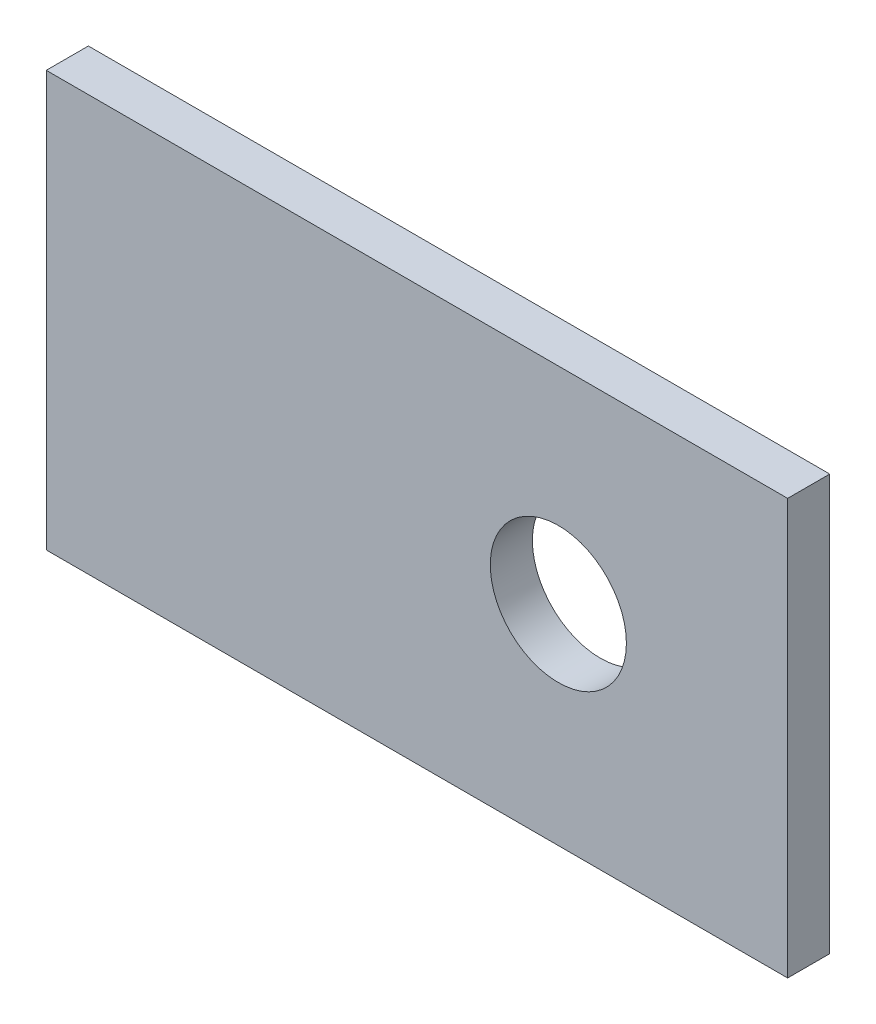
ISO-10303-21;
HEADER;
FILE_DESCRIPTION(('STEP AP214'),'2;1');
FILE_NAME('part.step','',(''),(''),'','','');
FILE_SCHEMA(('AUTOMOTIVE_DESIGN { 1 0 10303 214 1 1 1 1 }'));
ENDSEC;
DATA;
#1=APPLICATION_CONTEXT('core data for automotive mechanical design processes');
#2=APPLICATION_PROTOCOL_DEFINITION('international standard','automotive_design',2000,#1);
#3=PRODUCT_CONTEXT('',#1,'mechanical');
#4=PRODUCT('Part','Part','',(#3));
#5=PRODUCT_RELATED_PRODUCT_CATEGORY('part','',(#4));
#6=PRODUCT_DEFINITION_FORMATION('','',#4);
#7=PRODUCT_DEFINITION_CONTEXT('part definition',#1,'design');
#8=PRODUCT_DEFINITION('design','',#6,#7);
#9=PRODUCT_DEFINITION_SHAPE('','',#8);
#10=(LENGTH_UNIT() NAMED_UNIT(*) SI_UNIT(.MILLI.,.METRE.));
#11=(NAMED_UNIT(*) PLANE_ANGLE_UNIT() SI_UNIT($,.RADIAN.));
#12=(NAMED_UNIT(*) SI_UNIT($,.STERADIAN.) SOLID_ANGLE_UNIT());
#13=UNCERTAINTY_MEASURE_WITH_UNIT(LENGTH_MEASURE(1.E-05),#10,'distance_accuracy_value','');
#14=(GEOMETRIC_REPRESENTATION_CONTEXT(3) GLOBAL_UNCERTAINTY_ASSIGNED_CONTEXT((#13)) GLOBAL_UNIT_ASSIGNED_CONTEXT((#10,
#11,#12)) REPRESENTATION_CONTEXT('',''));
#15=CARTESIAN_POINT('',(0.,0.,0.));
#16=DIRECTION('',(0.,0.,1.));
#17=DIRECTION('',(1.,0.,0.));
#18=AXIS2_PLACEMENT_3D('',#15,#16,#17);
#19=CARTESIAN_POINT('',(26.415,-14.8,3.));
#20=DIRECTION('',(-1.,0.,0.));
#21=DIRECTION('',(0.,0.,1.));
#22=AXIS2_PLACEMENT_3D('',#19,#20,#21);
#23=PLANE('',#22);
#24=DIRECTION('',(0.,1.,0.));
#25=VECTOR('',#24,1.);
#26=CARTESIAN_POINT('',(26.415,-14.8,0.));
#27=LINE('',#26,#25);
#28=CARTESIAN_POINT('',(26.415,-14.8,0.));
#29=VERTEX_POINT('',#28);
#30=CARTESIAN_POINT('',(26.415,14.8,0.));
#31=VERTEX_POINT('',#30);
#32=EDGE_CURVE('E113',#29,#31,#27,.T.);
#33=ORIENTED_EDGE('',*,*,#32,.T.);
#34=DIRECTION('',(0.,0.,-1.));
#35=VECTOR('',#34,1.);
#36=CARTESIAN_POINT('',(26.415,14.8,3.));
#37=LINE('',#36,#35);
#38=CARTESIAN_POINT('',(26.415,14.8,3.));
#39=VERTEX_POINT('',#38);
#40=EDGE_CURVE('E11',#39,#31,#37,.T.);
#41=ORIENTED_EDGE('',*,*,#40,.F.);
#42=DIRECTION('',(0.,1.,0.));
#43=VECTOR('',#42,1.);
#44=CARTESIAN_POINT('',(26.415,-14.8,3.));
#45=LINE('',#44,#43);
#46=CARTESIAN_POINT('',(26.415,-14.8,3.));
#47=VERTEX_POINT('',#46);
#48=EDGE_CURVE('E96',#47,#39,#45,.T.);
#49=ORIENTED_EDGE('',*,*,#48,.F.);
#50=DIRECTION('',(0.,0.,-1.));
#51=VECTOR('',#50,1.);
#52=CARTESIAN_POINT('',(26.415,-14.8,3.));
#53=LINE('',#52,#51);
#54=EDGE_CURVE('E109',#47,#29,#53,.T.);
#55=ORIENTED_EDGE('',*,*,#54,.T.);
#56=EDGE_LOOP('',(#33,#41,#49,#55));
#57=FACE_BOUND('',#56,.T.);
#58=ADVANCED_FACE('F43',(#57),#23,.F.);
#59=CARTESIAN_POINT('',(-26.415,14.8,3.));
#60=DIRECTION('',(0.,-1.,0.));
#61=DIRECTION('',(0.,0.,-1.));
#62=AXIS2_PLACEMENT_3D('',#59,#60,#61);
#63=PLANE('',#62);
#64=DIRECTION('',(-1.,0.,0.));
#65=VECTOR('',#64,1.);
#66=CARTESIAN_POINT('',(-26.415,14.8,0.));
#67=LINE('',#66,#65);
#68=CARTESIAN_POINT('',(-26.415,14.8,0.));
#69=VERTEX_POINT('',#68);
#70=EDGE_CURVE('E101',#31,#69,#67,.T.);
#71=ORIENTED_EDGE('',*,*,#70,.T.);
#72=DIRECTION('',(0.,0.,-1.));
#73=VECTOR('',#72,1.);
#74=CARTESIAN_POINT('',(-26.415,14.8,3.));
#75=LINE('',#74,#73);
#76=CARTESIAN_POINT('',(-26.415,14.8,3.));
#77=VERTEX_POINT('',#76);
#78=EDGE_CURVE('E53',#77,#69,#75,.T.);
#79=ORIENTED_EDGE('',*,*,#78,.F.);
#80=DIRECTION('',(-1.,0.,0.));
#81=VECTOR('',#80,1.);
#82=CARTESIAN_POINT('',(-26.415,14.8,3.));
#83=LINE('',#82,#81);
#84=EDGE_CURVE('E91',#39,#77,#83,.T.);
#85=ORIENTED_EDGE('',*,*,#84,.F.);
#86=ORIENTED_EDGE('',*,*,#40,.T.);
#87=EDGE_LOOP('',(#71,#79,#85,#86));
#88=FACE_BOUND('',#87,.T.);
#89=ADVANCED_FACE('F100',(#88),#63,.F.);
#90=CARTESIAN_POINT('',(-26.415,-14.8,3.));
#91=DIRECTION('',(1.,0.,0.));
#92=DIRECTION('',(0.,0.,-1.));
#93=AXIS2_PLACEMENT_3D('',#90,#91,#92);
#94=PLANE('',#93);
#95=DIRECTION('',(0.,-1.,0.));
#96=VECTOR('',#95,1.);
#97=CARTESIAN_POINT('',(-26.415,-14.8,0.));
#98=LINE('',#97,#96);
#99=CARTESIAN_POINT('',(-26.415,-14.8,0.));
#100=VERTEX_POINT('',#99);
#101=EDGE_CURVE('E78',#69,#100,#98,.T.);
#102=ORIENTED_EDGE('',*,*,#101,.T.);
#103=DIRECTION('',(0.,0.,-1.));
#104=VECTOR('',#103,1.);
#105=CARTESIAN_POINT('',(-26.415,-14.8,3.));
#106=LINE('',#105,#104);
#107=CARTESIAN_POINT('',(-26.415,-14.8,3.));
#108=VERTEX_POINT('',#107);
#109=EDGE_CURVE('E103',#108,#100,#106,.T.);
#110=ORIENTED_EDGE('',*,*,#109,.F.);
#111=DIRECTION('',(0.,-1.,0.));
#112=VECTOR('',#111,1.);
#113=CARTESIAN_POINT('',(-26.415,-14.8,3.));
#114=LINE('',#113,#112);
#115=EDGE_CURVE('E94',#77,#108,#114,.T.);
#116=ORIENTED_EDGE('',*,*,#115,.F.);
#117=ORIENTED_EDGE('',*,*,#78,.T.);
#118=EDGE_LOOP('',(#102,#110,#116,#117));
#119=FACE_BOUND('',#118,.T.);
#120=ADVANCED_FACE('F105',(#119),#94,.F.);
#121=CARTESIAN_POINT('',(-26.415,-14.8,3.));
#122=DIRECTION('',(0.,1.,0.));
#123=DIRECTION('',(0.,0.,1.));
#124=AXIS2_PLACEMENT_3D('',#121,#122,#123);
#125=PLANE('',#124);
#126=DIRECTION('',(1.,0.,0.));
#127=VECTOR('',#126,1.);
#128=CARTESIAN_POINT('',(-26.415,-14.8,0.));
#129=LINE('',#128,#127);
#130=EDGE_CURVE('E84',#100,#29,#129,.T.);
#131=ORIENTED_EDGE('',*,*,#130,.T.);
#132=ORIENTED_EDGE('',*,*,#54,.F.);
#133=DIRECTION('',(1.,0.,0.));
#134=VECTOR('',#133,1.);
#135=CARTESIAN_POINT('',(-26.415,-14.8,3.));
#136=LINE('',#135,#134);
#137=EDGE_CURVE('E61',#108,#47,#136,.T.);
#138=ORIENTED_EDGE('',*,*,#137,.F.);
#139=ORIENTED_EDGE('',*,*,#109,.T.);
#140=EDGE_LOOP('',(#131,#132,#138,#139));
#141=FACE_BOUND('',#140,.T.);
#142=ADVANCED_FACE('F126',(#141),#125,.F.);
#143=CARTESIAN_POINT('',(0.,0.,3.));
#144=DIRECTION('',(0.,0.,-1.));
#145=DIRECTION('',(-1.,0.,0.));
#146=AXIS2_PLACEMENT_3D('',#143,#144,#145);
#147=PLANE('',#146);
#148=CARTESIAN_POINT('',(10.075,0.110000000000002,3.));
#149=DIRECTION('',(0.,0.,1.));
#150=DIRECTION('',(1.,0.,0.));
#151=AXIS2_PLACEMENT_3D('',#148,#149,#150);
#152=CIRCLE('',#151,4.85);
#153=CARTESIAN_POINT('',(14.925,0.110000000000002,3.));
#154=VERTEX_POINT('',#153);
#155=EDGE_CURVE('E133',#154,#154,#152,.T.);
#156=ORIENTED_EDGE('',*,*,#155,.F.);
#157=EDGE_LOOP('',(#156));
#158=FACE_BOUND('',#157,.T.);
#159=ORIENTED_EDGE('',*,*,#48,.T.);
#160=ORIENTED_EDGE('',*,*,#84,.T.);
#161=ORIENTED_EDGE('',*,*,#115,.T.);
#162=ORIENTED_EDGE('',*,*,#137,.T.);
#163=EDGE_LOOP('',(#159,#160,#161,#162));
#164=FACE_BOUND('',#163,.T.);
#165=ADVANCED_FACE('F92',(#158,#164),#147,.F.);
#166=CARTESIAN_POINT('',(0.,0.,0.));
#167=DIRECTION('',(0.,0.,-1.));
#168=DIRECTION('',(-1.,0.,0.));
#169=AXIS2_PLACEMENT_3D('',#166,#167,#168);
#170=PLANE('',#169);
#171=CARTESIAN_POINT('',(10.075,0.110000000000002,0.));
#172=DIRECTION('',(0.,0.,-1.));
#173=DIRECTION('',(-1.,0.,0.));
#174=AXIS2_PLACEMENT_3D('',#171,#172,#173);
#175=CIRCLE('',#174,4.85);
#176=CARTESIAN_POINT('',(5.225,0.110000000000002,0.));
#177=VERTEX_POINT('',#176);
#178=EDGE_CURVE('E46',#177,#177,#175,.T.);
#179=ORIENTED_EDGE('',*,*,#178,.F.);
#180=EDGE_LOOP('',(#179));
#181=FACE_BOUND('',#180,.T.);
#182=ORIENTED_EDGE('',*,*,#32,.F.);
#183=ORIENTED_EDGE('',*,*,#130,.F.);
#184=ORIENTED_EDGE('',*,*,#101,.F.);
#185=ORIENTED_EDGE('',*,*,#70,.F.);
#186=EDGE_LOOP('',(#182,#183,#184,#185));
#187=FACE_BOUND('',#186,.T.);
#188=ADVANCED_FACE('F129',(#181,#187),#170,.T.);
#189=CARTESIAN_POINT('',(10.075,0.110000000000002,-7.));
#190=DIRECTION('',(0.,0.,1.));
#191=DIRECTION('',(1.,0.,0.));
#192=AXIS2_PLACEMENT_3D('',#189,#190,#191);
#193=CYLINDRICAL_SURFACE('',#192,4.85);
#194=ORIENTED_EDGE('',*,*,#178,.T.);
#195=EDGE_LOOP('',(#194));
#196=FACE_BOUND('',#195,.T.);
#197=ORIENTED_EDGE('',*,*,#155,.T.);
#198=EDGE_LOOP('',(#197));
#199=FACE_BOUND('',#198,.T.);
#200=ADVANCED_FACE('F142',(#196,#199),#193,.F.);
#201=CLOSED_SHELL('',(#58,#89,#120,#142,#165,#188,#200));
#202=MANIFOLD_SOLID_BREP('B2',#201);
#203=ADVANCED_BREP_SHAPE_REPRESENTATION('',(#18,#202),#14);
#204=SHAPE_DEFINITION_REPRESENTATION(#9,#203);
ENDSEC;
END-ISO-10303-21;
